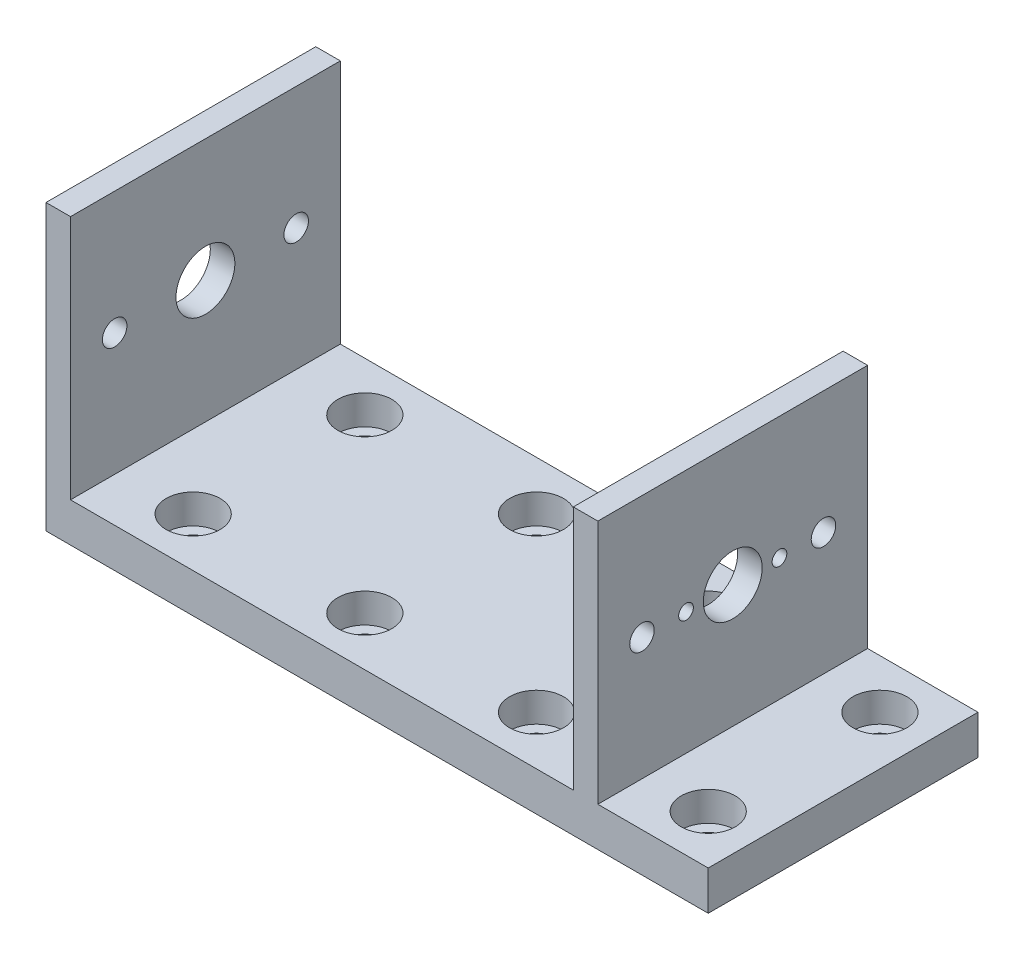
ISO-10303-21;
HEADER;
FILE_DESCRIPTION(('STEP AP214'),'2;1');
FILE_NAME('part.step','',(''),(''),'','','');
FILE_SCHEMA(('AUTOMOTIVE_DESIGN { 1 0 10303 214 1 1 1 1 }'));
ENDSEC;
DATA;
#1=APPLICATION_CONTEXT('core data for automotive mechanical design processes');
#2=APPLICATION_PROTOCOL_DEFINITION('international standard','automotive_design',2000,#1);
#3=PRODUCT_CONTEXT('',#1,'mechanical');
#4=PRODUCT('Part','Part','',(#3));
#5=PRODUCT_RELATED_PRODUCT_CATEGORY('part','',(#4));
#6=PRODUCT_DEFINITION_FORMATION('','',#4);
#7=PRODUCT_DEFINITION_CONTEXT('part definition',#1,'design');
#8=PRODUCT_DEFINITION('design','',#6,#7);
#9=PRODUCT_DEFINITION_SHAPE('','',#8);
#10=(LENGTH_UNIT() NAMED_UNIT(*) SI_UNIT(.MILLI.,.METRE.));
#11=(NAMED_UNIT(*) PLANE_ANGLE_UNIT() SI_UNIT($,.RADIAN.));
#12=(NAMED_UNIT(*) SI_UNIT($,.STERADIAN.) SOLID_ANGLE_UNIT());
#13=UNCERTAINTY_MEASURE_WITH_UNIT(LENGTH_MEASURE(1.E-05),#10,'distance_accuracy_value','');
#14=(GEOMETRIC_REPRESENTATION_CONTEXT(3) GLOBAL_UNCERTAINTY_ASSIGNED_CONTEXT((#13)) GLOBAL_UNIT_ASSIGNED_CONTEXT((#10,
#11,#12)) REPRESENTATION_CONTEXT('',''));
#15=CARTESIAN_POINT('',(0.,0.,0.));
#16=DIRECTION('',(0.,0.,1.));
#17=DIRECTION('',(1.,0.,0.));
#18=AXIS2_PLACEMENT_3D('',#15,#16,#17);
#19=CARTESIAN_POINT('',(0.,8.,0.));
#20=DIRECTION('',(0.,1.,0.));
#21=DIRECTION('',(0.,0.,1.));
#22=AXIS2_PLACEMENT_3D('',#19,#20,#21);
#23=PLANE('',#22);
#24=CARTESIAN_POINT('',(52.5,8.,-17.5));
#25=DIRECTION('',(0.,1.,0.));
#26=DIRECTION('',(0.,0.,1.));
#27=AXIS2_PLACEMENT_3D('',#24,#25,#26);
#28=CIRCLE('',#27,5.5);
#29=CARTESIAN_POINT('',(52.5,8.,-12.));
#30=VERTEX_POINT('',#29);
#31=EDGE_CURVE('E220',#30,#30,#28,.T.);
#32=ORIENTED_EDGE('',*,*,#31,.F.);
#33=EDGE_LOOP('',(#32));
#34=FACE_BOUND('',#33,.T.);
#35=CARTESIAN_POINT('',(52.5,8.,17.5));
#36=DIRECTION('',(0.,1.,0.));
#37=DIRECTION('',(0.,0.,1.));
#38=AXIS2_PLACEMENT_3D('',#35,#36,#37);
#39=CIRCLE('',#38,5.5);
#40=CARTESIAN_POINT('',(52.5,8.,23.));
#41=VERTEX_POINT('',#40);
#42=EDGE_CURVE('E226',#41,#41,#39,.T.);
#43=ORIENTED_EDGE('',*,*,#42,.F.);
#44=EDGE_LOOP('',(#43));
#45=FACE_BOUND('',#44,.T.);
#46=DIRECTION('',(-1.,0.,0.));
#47=VECTOR('',#46,1.);
#48=CARTESIAN_POINT('',(62.5,8.,-27.5));
#49=LINE('',#48,#47);
#50=CARTESIAN_POINT('',(62.5,8.,-27.5));
#51=VERTEX_POINT('',#50);
#52=CARTESIAN_POINT('',(40.,8.,-27.5));
#53=VERTEX_POINT('',#52);
#54=EDGE_CURVE('E132',#51,#53,#49,.T.);
#55=ORIENTED_EDGE('',*,*,#54,.T.);
#56=DIRECTION('',(0.,0.,-1.));
#57=VECTOR('',#56,1.);
#58=CARTESIAN_POINT('',(40.,8.,-27.5));
#59=LINE('',#58,#57);
#60=CARTESIAN_POINT('',(40.,8.,27.5));
#61=VERTEX_POINT('',#60);
#62=EDGE_CURVE('E60',#61,#53,#59,.T.);
#63=ORIENTED_EDGE('',*,*,#62,.F.);
#64=DIRECTION('',(1.,0.,0.));
#65=VECTOR('',#64,1.);
#66=CARTESIAN_POINT('',(62.5,8.,27.5));
#67=LINE('',#66,#65);
#68=CARTESIAN_POINT('',(62.5,8.,27.5));
#69=VERTEX_POINT('',#68);
#70=EDGE_CURVE('E264',#61,#69,#67,.T.);
#71=ORIENTED_EDGE('',*,*,#70,.T.);
#72=DIRECTION('',(0.,0.,-1.));
#73=VECTOR('',#72,1.);
#74=CARTESIAN_POINT('',(62.5,8.,-27.5));
#75=LINE('',#74,#73);
#76=EDGE_CURVE('E133',#69,#51,#75,.T.);
#77=ORIENTED_EDGE('',*,*,#76,.T.);
#78=EDGE_LOOP('',(#55,#63,#71,#77));
#79=FACE_BOUND('',#78,.T.);
#80=ADVANCED_FACE('F43',(#34,#45,#79),#23,.T.);
#81=CARTESIAN_POINT('',(-52.5,8.,-17.5));
#82=DIRECTION('',(0.,1.,0.));
#83=DIRECTION('',(0.,0.,1.));
#84=AXIS2_PLACEMENT_3D('',#81,#82,#83);
#85=CIRCLE('',#84,5.5);
#86=CARTESIAN_POINT('',(-52.5,8.,-12.));
#87=VERTEX_POINT('',#86);
#88=EDGE_CURVE('E210',#87,#87,#85,.T.);
#89=ORIENTED_EDGE('',*,*,#88,.F.);
#90=EDGE_LOOP('',(#89));
#91=FACE_BOUND('',#90,.T.);
#92=CARTESIAN_POINT('',(-52.5,8.,17.5));
#93=DIRECTION('',(0.,1.,0.));
#94=DIRECTION('',(0.,0.,1.));
#95=AXIS2_PLACEMENT_3D('',#92,#93,#94);
#96=CIRCLE('',#95,5.5);
#97=CARTESIAN_POINT('',(-52.5,8.,23.));
#98=VERTEX_POINT('',#97);
#99=EDGE_CURVE('E202',#98,#98,#96,.T.);
#100=ORIENTED_EDGE('',*,*,#99,.F.);
#101=EDGE_LOOP('',(#100));
#102=FACE_BOUND('',#101,.T.);
#103=CARTESIAN_POINT('',(-17.5,8.,17.5));
#104=DIRECTION('',(0.,1.,0.));
#105=DIRECTION('',(0.,0.,1.));
#106=AXIS2_PLACEMENT_3D('',#103,#104,#105);
#107=CIRCLE('',#106,5.5);
#108=CARTESIAN_POINT('',(-17.5,8.,23.));
#109=VERTEX_POINT('',#108);
#110=EDGE_CURVE('E196',#109,#109,#107,.T.);
#111=ORIENTED_EDGE('',*,*,#110,.F.);
#112=EDGE_LOOP('',(#111));
#113=FACE_BOUND('',#112,.T.);
#114=CARTESIAN_POINT('',(17.5,8.,17.5));
#115=DIRECTION('',(0.,1.,0.));
#116=DIRECTION('',(0.,0.,1.));
#117=AXIS2_PLACEMENT_3D('',#114,#115,#116);
#118=CIRCLE('',#117,5.5);
#119=CARTESIAN_POINT('',(17.5,8.,23.));
#120=VERTEX_POINT('',#119);
#121=EDGE_CURVE('E189',#120,#120,#118,.T.);
#122=ORIENTED_EDGE('',*,*,#121,.F.);
#123=EDGE_LOOP('',(#122));
#124=FACE_BOUND('',#123,.T.);
#125=CARTESIAN_POINT('',(17.5,8.,-17.5));
#126=DIRECTION('',(0.,1.,0.));
#127=DIRECTION('',(0.,0.,1.));
#128=AXIS2_PLACEMENT_3D('',#125,#126,#127);
#129=CIRCLE('',#128,5.5);
#130=CARTESIAN_POINT('',(17.5,8.,-12.));
#131=VERTEX_POINT('',#130);
#132=EDGE_CURVE('E214',#131,#131,#129,.T.);
#133=ORIENTED_EDGE('',*,*,#132,.F.);
#134=EDGE_LOOP('',(#133));
#135=FACE_BOUND('',#134,.T.);
#136=CARTESIAN_POINT('',(-17.5,8.,-17.5));
#137=DIRECTION('',(0.,1.,0.));
#138=DIRECTION('',(0.,0.,1.));
#139=AXIS2_PLACEMENT_3D('',#136,#137,#138);
#140=CIRCLE('',#139,5.5);
#141=CARTESIAN_POINT('',(-17.5,8.,-12.));
#142=VERTEX_POINT('',#141);
#143=EDGE_CURVE('E207',#142,#142,#140,.T.);
#144=ORIENTED_EDGE('',*,*,#143,.F.);
#145=EDGE_LOOP('',(#144));
#146=FACE_BOUND('',#145,.T.);
#147=CARTESIAN_POINT('',(-67.5,8.,27.5));
#148=VERTEX_POINT('',#147);
#149=CARTESIAN_POINT('',(35.,8.,27.5));
#150=VERTEX_POINT('',#149);
#151=EDGE_CURVE('E68',#148,#150,#67,.T.);
#152=ORIENTED_EDGE('',*,*,#151,.T.);
#153=DIRECTION('',(0.,0.,1.));
#154=VECTOR('',#153,1.);
#155=CARTESIAN_POINT('',(35.,8.,-27.5));
#156=LINE('',#155,#154);
#157=CARTESIAN_POINT('',(35.,8.,-27.5));
#158=VERTEX_POINT('',#157);
#159=EDGE_CURVE('E135',#158,#150,#156,.T.);
#160=ORIENTED_EDGE('',*,*,#159,.F.);
#161=CARTESIAN_POINT('',(-67.5,8.,-27.5));
#162=VERTEX_POINT('',#161);
#163=EDGE_CURVE('E123',#158,#162,#49,.T.);
#164=ORIENTED_EDGE('',*,*,#163,.T.);
#165=DIRECTION('',(0.,0.,-1.));
#166=VECTOR('',#165,1.);
#167=CARTESIAN_POINT('',(-67.5,8.,27.5));
#168=LINE('',#167,#166);
#169=EDGE_CURVE('E158',#148,#162,#168,.T.);
#170=ORIENTED_EDGE('',*,*,#169,.F.);
#171=EDGE_LOOP('',(#152,#160,#164,#170));
#172=FACE_BOUND('',#171,.T.);
#173=ADVANCED_FACE('F136',(#91,#102,#113,#124,#135,#146,#172),#23,.T.);
#174=CARTESIAN_POINT('',(-52.5,8.,-17.5));
#175=DIRECTION('',(0.,-1.,0.));
#176=DIRECTION('',(0.,0.,-1.));
#177=AXIS2_PLACEMENT_3D('',#174,#175,#176);
#178=CYLINDRICAL_SURFACE('',#177,3.25);
#179=CARTESIAN_POINT('',(-52.5,0.,-17.5));
#180=DIRECTION('',(0.,1.,0.));
#181=DIRECTION('',(0.,0.,1.));
#182=AXIS2_PLACEMENT_3D('',#179,#180,#181);
#183=CIRCLE('',#182,3.25);
#184=CARTESIAN_POINT('',(-52.5,0.,-14.25));
#185=VERTEX_POINT('',#184);
#186=EDGE_CURVE('E259',#185,#185,#183,.T.);
#187=ORIENTED_EDGE('',*,*,#186,.F.);
#188=EDGE_LOOP('',(#187));
#189=FACE_BOUND('',#188,.T.);
#190=CARTESIAN_POINT('',(-52.5,2.,-17.5));
#191=DIRECTION('',(0.,1.,0.));
#192=DIRECTION('',(0.,0.,1.));
#193=AXIS2_PLACEMENT_3D('',#190,#191,#192);
#194=CIRCLE('',#193,3.25);
#195=CARTESIAN_POINT('',(-52.5,2.,-14.25));
#196=VERTEX_POINT('',#195);
#197=EDGE_CURVE('E241',#196,#196,#194,.T.);
#198=ORIENTED_EDGE('',*,*,#197,.T.);
#199=EDGE_LOOP('',(#198));
#200=FACE_BOUND('',#199,.T.);
#201=ADVANCED_FACE('F375',(#189,#200),#178,.F.);
#202=CARTESIAN_POINT('',(-52.5,8.,17.5));
#203=DIRECTION('',(0.,-1.,0.));
#204=DIRECTION('',(0.,0.,-1.));
#205=AXIS2_PLACEMENT_3D('',#202,#203,#204);
#206=CYLINDRICAL_SURFACE('',#205,3.25);
#207=CARTESIAN_POINT('',(-52.5,0.,17.5));
#208=DIRECTION('',(0.,1.,0.));
#209=DIRECTION('',(0.,0.,-1.));
#210=AXIS2_PLACEMENT_3D('',#207,#208,#209);
#211=CIRCLE('',#210,3.25);
#212=CARTESIAN_POINT('',(-52.5,0.,14.25));
#213=VERTEX_POINT('',#212);
#214=EDGE_CURVE('E256',#213,#213,#211,.T.);
#215=ORIENTED_EDGE('',*,*,#214,.F.);
#216=EDGE_LOOP('',(#215));
#217=FACE_BOUND('',#216,.T.);
#218=CARTESIAN_POINT('',(-52.5,2.,17.5));
#219=DIRECTION('',(0.,1.,0.));
#220=DIRECTION('',(0.,0.,1.));
#221=AXIS2_PLACEMENT_3D('',#218,#219,#220);
#222=CIRCLE('',#221,3.25);
#223=CARTESIAN_POINT('',(-52.5,2.,20.75));
#224=VERTEX_POINT('',#223);
#225=EDGE_CURVE('E291',#224,#224,#222,.T.);
#226=ORIENTED_EDGE('',*,*,#225,.T.);
#227=EDGE_LOOP('',(#226));
#228=FACE_BOUND('',#227,.T.);
#229=ADVANCED_FACE('F525',(#217,#228),#206,.F.);
#230=CARTESIAN_POINT('',(-17.5,8.,17.5));
#231=DIRECTION('',(0.,-1.,0.));
#232=DIRECTION('',(0.,0.,-1.));
#233=AXIS2_PLACEMENT_3D('',#230,#231,#232);
#234=CYLINDRICAL_SURFACE('',#233,3.25);
#235=CARTESIAN_POINT('',(-17.5,0.,17.5));
#236=DIRECTION('',(0.,1.,0.));
#237=DIRECTION('',(0.,0.,1.));
#238=AXIS2_PLACEMENT_3D('',#235,#236,#237);
#239=CIRCLE('',#238,3.25);
#240=CARTESIAN_POINT('',(-17.5,0.,20.75));
#241=VERTEX_POINT('',#240);
#242=EDGE_CURVE('E253',#241,#241,#239,.T.);
#243=ORIENTED_EDGE('',*,*,#242,.F.);
#244=EDGE_LOOP('',(#243));
#245=FACE_BOUND('',#244,.T.);
#246=CARTESIAN_POINT('',(-17.5,2.,17.5));
#247=DIRECTION('',(0.,1.,0.));
#248=DIRECTION('',(0.,0.,1.));
#249=AXIS2_PLACEMENT_3D('',#246,#247,#248);
#250=CIRCLE('',#249,3.25);
#251=CARTESIAN_POINT('',(-17.5,2.,20.75));
#252=VERTEX_POINT('',#251);
#253=EDGE_CURVE('E288',#252,#252,#250,.T.);
#254=ORIENTED_EDGE('',*,*,#253,.T.);
#255=EDGE_LOOP('',(#254));
#256=FACE_BOUND('',#255,.T.);
#257=ADVANCED_FACE('F522',(#245,#256),#234,.F.);
#258=CARTESIAN_POINT('',(-17.5,8.,-17.5));
#259=DIRECTION('',(0.,-1.,0.));
#260=DIRECTION('',(0.,0.,-1.));
#261=AXIS2_PLACEMENT_3D('',#258,#259,#260);
#262=CYLINDRICAL_SURFACE('',#261,3.25);
#263=CARTESIAN_POINT('',(-17.5,0.,-17.5));
#264=DIRECTION('',(0.,1.,0.));
#265=DIRECTION('',(0.,0.,-1.));
#266=AXIS2_PLACEMENT_3D('',#263,#264,#265);
#267=CIRCLE('',#266,3.25);
#268=CARTESIAN_POINT('',(-17.5,0.,-20.75));
#269=VERTEX_POINT('',#268);
#270=EDGE_CURVE('E250',#269,#269,#267,.T.);
#271=ORIENTED_EDGE('',*,*,#270,.F.);
#272=EDGE_LOOP('',(#271));
#273=FACE_BOUND('',#272,.T.);
#274=CARTESIAN_POINT('',(-17.5,2.,-17.5));
#275=DIRECTION('',(0.,1.,0.));
#276=DIRECTION('',(0.,0.,1.));
#277=AXIS2_PLACEMENT_3D('',#274,#275,#276);
#278=CIRCLE('',#277,3.25);
#279=CARTESIAN_POINT('',(-17.5,2.,-14.25));
#280=VERTEX_POINT('',#279);
#281=EDGE_CURVE('E285',#280,#280,#278,.T.);
#282=ORIENTED_EDGE('',*,*,#281,.T.);
#283=EDGE_LOOP('',(#282));
#284=FACE_BOUND('',#283,.T.);
#285=ADVANCED_FACE('F518',(#273,#284),#262,.F.);
#286=CARTESIAN_POINT('',(52.5,8.,17.5));
#287=DIRECTION('',(0.,-1.,0.));
#288=DIRECTION('',(0.,0.,-1.));
#289=AXIS2_PLACEMENT_3D('',#286,#287,#288);
#290=CYLINDRICAL_SURFACE('',#289,3.25);
#291=CARTESIAN_POINT('',(52.5,0.,17.5));
#292=DIRECTION('',(0.,1.,0.));
#293=DIRECTION('',(0.,0.,1.));
#294=AXIS2_PLACEMENT_3D('',#291,#292,#293);
#295=CIRCLE('',#294,3.25);
#296=CARTESIAN_POINT('',(52.5,0.,20.75));
#297=VERTEX_POINT('',#296);
#298=EDGE_CURVE('E247',#297,#297,#295,.T.);
#299=ORIENTED_EDGE('',*,*,#298,.F.);
#300=EDGE_LOOP('',(#299));
#301=FACE_BOUND('',#300,.T.);
#302=CARTESIAN_POINT('',(52.5,2.,17.5));
#303=DIRECTION('',(0.,1.,0.));
#304=DIRECTION('',(0.,0.,1.));
#305=AXIS2_PLACEMENT_3D('',#302,#303,#304);
#306=CIRCLE('',#305,3.25);
#307=CARTESIAN_POINT('',(52.5,2.,20.75));
#308=VERTEX_POINT('',#307);
#309=EDGE_CURVE('E282',#308,#308,#306,.T.);
#310=ORIENTED_EDGE('',*,*,#309,.T.);
#311=EDGE_LOOP('',(#310));
#312=FACE_BOUND('',#311,.T.);
#313=ADVANCED_FACE('F514',(#301,#312),#290,.F.);
#314=CARTESIAN_POINT('',(17.5,8.,17.5));
#315=DIRECTION('',(0.,-1.,0.));
#316=DIRECTION('',(0.,0.,-1.));
#317=AXIS2_PLACEMENT_3D('',#314,#315,#316);
#318=CYLINDRICAL_SURFACE('',#317,3.25);
#319=CARTESIAN_POINT('',(17.5,0.,17.5));
#320=DIRECTION('',(0.,1.,0.));
#321=DIRECTION('',(0.,0.,-1.));
#322=AXIS2_PLACEMENT_3D('',#319,#320,#321);
#323=CIRCLE('',#322,3.25);
#324=CARTESIAN_POINT('',(17.5,0.,14.25));
#325=VERTEX_POINT('',#324);
#326=EDGE_CURVE('E244',#325,#325,#323,.T.);
#327=ORIENTED_EDGE('',*,*,#326,.F.);
#328=EDGE_LOOP('',(#327));
#329=FACE_BOUND('',#328,.T.);
#330=CARTESIAN_POINT('',(17.5,2.,17.5));
#331=DIRECTION('',(0.,1.,0.));
#332=DIRECTION('',(0.,0.,1.));
#333=AXIS2_PLACEMENT_3D('',#330,#331,#332);
#334=CIRCLE('',#333,3.25);
#335=CARTESIAN_POINT('',(17.5,2.,20.75));
#336=VERTEX_POINT('',#335);
#337=EDGE_CURVE('E279',#336,#336,#334,.T.);
#338=ORIENTED_EDGE('',*,*,#337,.T.);
#339=EDGE_LOOP('',(#338));
#340=FACE_BOUND('',#339,.T.);
#341=ADVANCED_FACE('F510',(#329,#340),#318,.F.);
#342=CARTESIAN_POINT('',(17.5,8.,-17.5));
#343=DIRECTION('',(0.,-1.,0.));
#344=DIRECTION('',(0.,0.,-1.));
#345=AXIS2_PLACEMENT_3D('',#342,#343,#344);
#346=CYLINDRICAL_SURFACE('',#345,3.25);
#347=CARTESIAN_POINT('',(17.5,0.,-17.5));
#348=DIRECTION('',(0.,1.,0.));
#349=DIRECTION('',(0.,0.,1.));
#350=AXIS2_PLACEMENT_3D('',#347,#348,#349);
#351=CIRCLE('',#350,3.25);
#352=CARTESIAN_POINT('',(17.5,0.,-14.25));
#353=VERTEX_POINT('',#352);
#354=EDGE_CURVE('E240',#353,#353,#351,.T.);
#355=ORIENTED_EDGE('',*,*,#354,.F.);
#356=EDGE_LOOP('',(#355));
#357=FACE_BOUND('',#356,.T.);
#358=CARTESIAN_POINT('',(17.5,2.,-17.5));
#359=DIRECTION('',(0.,1.,0.));
#360=DIRECTION('',(0.,0.,1.));
#361=AXIS2_PLACEMENT_3D('',#358,#359,#360);
#362=CIRCLE('',#361,3.25);
#363=CARTESIAN_POINT('',(17.5,2.,-14.25));
#364=VERTEX_POINT('',#363);
#365=EDGE_CURVE('E276',#364,#364,#362,.T.);
#366=ORIENTED_EDGE('',*,*,#365,.T.);
#367=EDGE_LOOP('',(#366));
#368=FACE_BOUND('',#367,.T.);
#369=ADVANCED_FACE('F506',(#357,#368),#346,.F.);
#370=CARTESIAN_POINT('',(52.5,8.,-17.5));
#371=DIRECTION('',(0.,-1.,0.));
#372=DIRECTION('',(0.,0.,-1.));
#373=AXIS2_PLACEMENT_3D('',#370,#371,#372);
#374=CYLINDRICAL_SURFACE('',#373,3.25);
#375=CARTESIAN_POINT('',(52.5,0.,-17.5));
#376=DIRECTION('',(0.,1.,0.));
#377=DIRECTION('',(0.,0.,-1.));
#378=AXIS2_PLACEMENT_3D('',#375,#376,#377);
#379=CIRCLE('',#378,3.25);
#380=CARTESIAN_POINT('',(52.5,0.,-20.75));
#381=VERTEX_POINT('',#380);
#382=EDGE_CURVE('E237',#381,#381,#379,.T.);
#383=ORIENTED_EDGE('',*,*,#382,.F.);
#384=EDGE_LOOP('',(#383));
#385=FACE_BOUND('',#384,.T.);
#386=CARTESIAN_POINT('',(52.5,2.,-17.5));
#387=DIRECTION('',(0.,1.,0.));
#388=DIRECTION('',(0.,0.,1.));
#389=AXIS2_PLACEMENT_3D('',#386,#387,#388);
#390=CIRCLE('',#389,3.25);
#391=CARTESIAN_POINT('',(52.5,2.,-14.25));
#392=VERTEX_POINT('',#391);
#393=EDGE_CURVE('E234',#392,#392,#390,.T.);
#394=ORIENTED_EDGE('',*,*,#393,.T.);
#395=EDGE_LOOP('',(#394));
#396=FACE_BOUND('',#395,.T.);
#397=ADVANCED_FACE('F385',(#385,#396),#374,.F.);
#398=CARTESIAN_POINT('',(0.,0.,0.));
#399=DIRECTION('',(0.,1.,0.));
#400=DIRECTION('',(0.,0.,1.));
#401=AXIS2_PLACEMENT_3D('',#398,#399,#400);
#402=PLANE('',#401);
#403=DIRECTION('',(1.,0.,0.));
#404=VECTOR('',#403,1.);
#405=CARTESIAN_POINT('',(62.5,0.,27.5));
#406=LINE('',#405,#404);
#407=CARTESIAN_POINT('',(-72.5,0.,27.5));
#408=VERTEX_POINT('',#407);
#409=CARTESIAN_POINT('',(62.5,0.,27.5));
#410=VERTEX_POINT('',#409);
#411=EDGE_CURVE('E262',#408,#410,#406,.T.);
#412=ORIENTED_EDGE('',*,*,#411,.F.);
#413=DIRECTION('',(0.,0.,1.));
#414=VECTOR('',#413,1.);
#415=CARTESIAN_POINT('',(-72.5,0.,27.5));
#416=LINE('',#415,#414);
#417=CARTESIAN_POINT('',(-72.5,0.,-27.5));
#418=VERTEX_POINT('',#417);
#419=EDGE_CURVE('E180',#418,#408,#416,.T.);
#420=ORIENTED_EDGE('',*,*,#419,.F.);
#421=DIRECTION('',(-1.,0.,0.));
#422=VECTOR('',#421,1.);
#423=CARTESIAN_POINT('',(62.5,0.,-27.5));
#424=LINE('',#423,#422);
#425=CARTESIAN_POINT('',(62.5,0.,-27.5));
#426=VERTEX_POINT('',#425);
#427=EDGE_CURVE('E270',#426,#418,#424,.T.);
#428=ORIENTED_EDGE('',*,*,#427,.F.);
#429=DIRECTION('',(0.,0.,-1.));
#430=VECTOR('',#429,1.);
#431=CARTESIAN_POINT('',(62.5,0.,-27.5));
#432=LINE('',#431,#430);
#433=EDGE_CURVE('E268',#410,#426,#432,.T.);
#434=ORIENTED_EDGE('',*,*,#433,.F.);
#435=EDGE_LOOP('',(#412,#420,#428,#434));
#436=FACE_BOUND('',#435,.T.);
#437=ORIENTED_EDGE('',*,*,#186,.T.);
#438=EDGE_LOOP('',(#437));
#439=FACE_BOUND('',#438,.T.);
#440=ORIENTED_EDGE('',*,*,#214,.T.);
#441=EDGE_LOOP('',(#440));
#442=FACE_BOUND('',#441,.T.);
#443=ORIENTED_EDGE('',*,*,#242,.T.);
#444=EDGE_LOOP('',(#443));
#445=FACE_BOUND('',#444,.T.);
#446=ORIENTED_EDGE('',*,*,#270,.T.);
#447=EDGE_LOOP('',(#446));
#448=FACE_BOUND('',#447,.T.);
#449=ORIENTED_EDGE('',*,*,#298,.T.);
#450=EDGE_LOOP('',(#449));
#451=FACE_BOUND('',#450,.T.);
#452=ORIENTED_EDGE('',*,*,#326,.T.);
#453=EDGE_LOOP('',(#452));
#454=FACE_BOUND('',#453,.T.);
#455=ORIENTED_EDGE('',*,*,#354,.T.);
#456=EDGE_LOOP('',(#455));
#457=FACE_BOUND('',#456,.T.);
#458=ORIENTED_EDGE('',*,*,#382,.T.);
#459=EDGE_LOOP('',(#458));
#460=FACE_BOUND('',#459,.T.);
#461=ADVANCED_FACE('F382',(#436,#439,#442,#445,#448,#451,#454,#457,#460),#402,.F.);
#462=CARTESIAN_POINT('',(62.5,8.,27.5));
#463=DIRECTION('',(0.,0.,-1.));
#464=DIRECTION('',(-1.,0.,0.));
#465=AXIS2_PLACEMENT_3D('',#462,#463,#464);
#466=PLANE('',#465);
#467=ORIENTED_EDGE('',*,*,#411,.T.);
#468=DIRECTION('',(0.,-1.,0.));
#469=VECTOR('',#468,1.);
#470=CARTESIAN_POINT('',(62.5,8.,27.5));
#471=LINE('',#470,#469);
#472=EDGE_CURVE('E11',#69,#410,#471,.T.);
#473=ORIENTED_EDGE('',*,*,#472,.F.);
#474=ORIENTED_EDGE('',*,*,#70,.F.);
#475=DIRECTION('',(0.,-1.,0.));
#476=VECTOR('',#475,1.);
#477=CARTESIAN_POINT('',(40.,58.,27.5));
#478=LINE('',#477,#476);
#479=CARTESIAN_POINT('',(40.,58.,27.5));
#480=VERTEX_POINT('',#479);
#481=EDGE_CURVE('E147',#480,#61,#478,.T.);
#482=ORIENTED_EDGE('',*,*,#481,.F.);
#483=DIRECTION('',(1.,0.,0.));
#484=VECTOR('',#483,1.);
#485=CARTESIAN_POINT('',(35.,58.,27.5));
#486=LINE('',#485,#484);
#487=CARTESIAN_POINT('',(35.,58.,27.5));
#488=VERTEX_POINT('',#487);
#489=EDGE_CURVE('E155',#488,#480,#486,.T.);
#490=ORIENTED_EDGE('',*,*,#489,.F.);
#491=DIRECTION('',(0.,-1.,0.));
#492=VECTOR('',#491,1.);
#493=CARTESIAN_POINT('',(35.,58.,27.5));
#494=LINE('',#493,#492);
#495=EDGE_CURVE('E144',#488,#150,#494,.T.);
#496=ORIENTED_EDGE('',*,*,#495,.T.);
#497=ORIENTED_EDGE('',*,*,#151,.F.);
#498=DIRECTION('',(0.,-1.,0.));
#499=VECTOR('',#498,1.);
#500=CARTESIAN_POINT('',(-67.5,58.,27.5));
#501=LINE('',#500,#499);
#502=CARTESIAN_POINT('',(-67.5,58.,27.5));
#503=VERTEX_POINT('',#502);
#504=EDGE_CURVE('E177',#503,#148,#501,.T.);
#505=ORIENTED_EDGE('',*,*,#504,.F.);
#506=DIRECTION('',(1.,0.,0.));
#507=VECTOR('',#506,1.);
#508=CARTESIAN_POINT('',(-72.5,58.,27.5));
#509=LINE('',#508,#507);
#510=CARTESIAN_POINT('',(-72.5,58.,27.5));
#511=VERTEX_POINT('',#510);
#512=EDGE_CURVE('E171',#511,#503,#509,.T.);
#513=ORIENTED_EDGE('',*,*,#512,.F.);
#514=DIRECTION('',(0.,1.,0.));
#515=VECTOR('',#514,1.);
#516=CARTESIAN_POINT('',(-72.5,8.,27.5));
#517=LINE('',#516,#515);
#518=EDGE_CURVE('E183',#408,#511,#517,.T.);
#519=ORIENTED_EDGE('',*,*,#518,.F.);
#520=EDGE_LOOP('',(#467,#473,#474,#482,#490,#496,#497,#505,#513,#519));
#521=FACE_BOUND('',#520,.T.);
#522=ADVANCED_FACE('F45',(#521),#466,.F.);
#523=CARTESIAN_POINT('',(62.5,8.,-27.5));
#524=DIRECTION('',(-1.,0.,0.));
#525=DIRECTION('',(0.,0.,1.));
#526=AXIS2_PLACEMENT_3D('',#523,#524,#525);
#527=PLANE('',#526);
#528=ORIENTED_EDGE('',*,*,#433,.T.);
#529=DIRECTION('',(0.,-1.,0.));
#530=VECTOR('',#529,1.);
#531=CARTESIAN_POINT('',(62.5,8.,-27.5));
#532=LINE('',#531,#530);
#533=EDGE_CURVE('E52',#51,#426,#532,.T.);
#534=ORIENTED_EDGE('',*,*,#533,.F.);
#535=ORIENTED_EDGE('',*,*,#76,.F.);
#536=ORIENTED_EDGE('',*,*,#472,.T.);
#537=EDGE_LOOP('',(#528,#534,#535,#536));
#538=FACE_BOUND('',#537,.T.);
#539=ADVANCED_FACE('F389',(#538),#527,.F.);
#540=CARTESIAN_POINT('',(62.5,8.,-27.5));
#541=DIRECTION('',(0.,0.,1.));
#542=DIRECTION('',(1.,0.,0.));
#543=AXIS2_PLACEMENT_3D('',#540,#541,#542);
#544=PLANE('',#543);
#545=ORIENTED_EDGE('',*,*,#427,.T.);
#546=DIRECTION('',(0.,-1.,0.));
#547=VECTOR('',#546,1.);
#548=CARTESIAN_POINT('',(-72.5,0.,-27.5));
#549=LINE('',#548,#547);
#550=CARTESIAN_POINT('',(-72.5,58.,-27.5));
#551=VERTEX_POINT('',#550);
#552=EDGE_CURVE('E185',#551,#418,#549,.T.);
#553=ORIENTED_EDGE('',*,*,#552,.F.);
#554=DIRECTION('',(-1.,0.,0.));
#555=VECTOR('',#554,1.);
#556=CARTESIAN_POINT('',(-67.5,58.,-27.5));
#557=LINE('',#556,#555);
#558=CARTESIAN_POINT('',(-67.5,58.,-27.5));
#559=VERTEX_POINT('',#558);
#560=EDGE_CURVE('E165',#559,#551,#557,.T.);
#561=ORIENTED_EDGE('',*,*,#560,.F.);
#562=DIRECTION('',(0.,-1.,0.));
#563=VECTOR('',#562,1.);
#564=CARTESIAN_POINT('',(-67.5,58.,-27.5));
#565=LINE('',#564,#563);
#566=EDGE_CURVE('E130',#559,#162,#565,.T.);
#567=ORIENTED_EDGE('',*,*,#566,.T.);
#568=ORIENTED_EDGE('',*,*,#163,.F.);
#569=DIRECTION('',(0.,-1.,0.));
#570=VECTOR('',#569,1.);
#571=CARTESIAN_POINT('',(35.,58.,-27.5));
#572=LINE('',#571,#570);
#573=CARTESIAN_POINT('',(35.,58.,-27.5));
#574=VERTEX_POINT('',#573);
#575=EDGE_CURVE('E126',#574,#158,#572,.T.);
#576=ORIENTED_EDGE('',*,*,#575,.F.);
#577=DIRECTION('',(-1.,0.,0.));
#578=VECTOR('',#577,1.);
#579=CARTESIAN_POINT('',(40.,58.,-27.5));
#580=LINE('',#579,#578);
#581=CARTESIAN_POINT('',(40.,58.,-27.5));
#582=VERTEX_POINT('',#581);
#583=EDGE_CURVE('E161',#582,#574,#580,.T.);
#584=ORIENTED_EDGE('',*,*,#583,.F.);
#585=DIRECTION('',(0.,-1.,0.));
#586=VECTOR('',#585,1.);
#587=CARTESIAN_POINT('',(40.,58.,-27.5));
#588=LINE('',#587,#586);
#589=EDGE_CURVE('E145',#582,#53,#588,.T.);
#590=ORIENTED_EDGE('',*,*,#589,.T.);
#591=ORIENTED_EDGE('',*,*,#54,.F.);
#592=ORIENTED_EDGE('',*,*,#533,.T.);
#593=EDGE_LOOP('',(#545,#553,#561,#567,#568,#576,#584,#590,#591,#592));
#594=FACE_BOUND('',#593,.T.);
#595=ADVANCED_FACE('F124',(#594),#544,.F.);
#596=CARTESIAN_POINT('',(52.5,2.,-17.5));
#597=DIRECTION('',(0.,1.,0.));
#598=DIRECTION('',(0.,0.,1.));
#599=AXIS2_PLACEMENT_3D('',#596,#597,#598);
#600=CYLINDRICAL_SURFACE('',#599,5.5);
#601=CARTESIAN_POINT('',(52.5,2.,-17.5));
#602=DIRECTION('',(0.,1.,0.));
#603=DIRECTION('',(0.,0.,1.));
#604=AXIS2_PLACEMENT_3D('',#601,#602,#603);
#605=CIRCLE('',#604,5.5);
#606=CARTESIAN_POINT('',(52.5,2.,-12.));
#607=VERTEX_POINT('',#606);
#608=EDGE_CURVE('E223',#607,#607,#605,.T.);
#609=ORIENTED_EDGE('',*,*,#608,.F.);
#610=EDGE_LOOP('',(#609));
#611=FACE_BOUND('',#610,.T.);
#612=ORIENTED_EDGE('',*,*,#31,.T.);
#613=EDGE_LOOP('',(#612));
#614=FACE_BOUND('',#613,.T.);
#615=ADVANCED_FACE('F388',(#611,#614),#600,.F.);
#616=CARTESIAN_POINT('',(52.5,2.,-17.5));
#617=DIRECTION('',(0.,1.,0.));
#618=DIRECTION('',(0.,0.,1.));
#619=AXIS2_PLACEMENT_3D('',#616,#617,#618);
#620=PLANE('',#619);
#621=ORIENTED_EDGE('',*,*,#393,.F.);
#622=EDGE_LOOP('',(#621));
#623=FACE_BOUND('',#622,.T.);
#624=ORIENTED_EDGE('',*,*,#608,.T.);
#625=EDGE_LOOP('',(#624));
#626=FACE_BOUND('',#625,.T.);
#627=ADVANCED_FACE('F481',(#623,#626),#620,.T.);
#628=CARTESIAN_POINT('',(17.5,2.,-17.5));
#629=DIRECTION('',(0.,1.,0.));
#630=DIRECTION('',(0.,0.,1.));
#631=AXIS2_PLACEMENT_3D('',#628,#629,#630);
#632=CYLINDRICAL_SURFACE('',#631,5.5);
#633=CARTESIAN_POINT('',(17.5,2.,-17.5));
#634=DIRECTION('',(0.,1.,0.));
#635=DIRECTION('',(0.,0.,1.));
#636=AXIS2_PLACEMENT_3D('',#633,#634,#635);
#637=CIRCLE('',#636,5.5);
#638=CARTESIAN_POINT('',(17.5,2.,-12.));
#639=VERTEX_POINT('',#638);
#640=EDGE_CURVE('E217',#639,#639,#637,.T.);
#641=ORIENTED_EDGE('',*,*,#640,.F.);
#642=EDGE_LOOP('',(#641));
#643=FACE_BOUND('',#642,.T.);
#644=ORIENTED_EDGE('',*,*,#132,.T.);
#645=EDGE_LOOP('',(#644));
#646=FACE_BOUND('',#645,.T.);
#647=ADVANCED_FACE('F478',(#643,#646),#632,.F.);
#648=CARTESIAN_POINT('',(17.5,2.,-17.5));
#649=DIRECTION('',(0.,1.,0.));
#650=DIRECTION('',(0.,0.,1.));
#651=AXIS2_PLACEMENT_3D('',#648,#649,#650);
#652=PLANE('',#651);
#653=ORIENTED_EDGE('',*,*,#365,.F.);
#654=EDGE_LOOP('',(#653));
#655=FACE_BOUND('',#654,.T.);
#656=ORIENTED_EDGE('',*,*,#640,.T.);
#657=EDGE_LOOP('',(#656));
#658=FACE_BOUND('',#657,.T.);
#659=ADVANCED_FACE('F446',(#655,#658),#652,.T.);
#660=CARTESIAN_POINT('',(17.5,2.,17.5));
#661=DIRECTION('',(0.,1.,0.));
#662=DIRECTION('',(0.,0.,1.));
#663=AXIS2_PLACEMENT_3D('',#660,#661,#662);
#664=CYLINDRICAL_SURFACE('',#663,5.5);
#665=CARTESIAN_POINT('',(17.5,2.,17.5));
#666=DIRECTION('',(0.,1.,0.));
#667=DIRECTION('',(0.,0.,1.));
#668=AXIS2_PLACEMENT_3D('',#665,#666,#667);
#669=CIRCLE('',#668,5.5);
#670=CARTESIAN_POINT('',(17.5,2.,23.));
#671=VERTEX_POINT('',#670);
#672=EDGE_CURVE('E193',#671,#671,#669,.T.);
#673=ORIENTED_EDGE('',*,*,#672,.F.);
#674=EDGE_LOOP('',(#673));
#675=FACE_BOUND('',#674,.T.);
#676=ORIENTED_EDGE('',*,*,#121,.T.);
#677=EDGE_LOOP('',(#676));
#678=FACE_BOUND('',#677,.T.);
#679=ADVANCED_FACE('F442',(#675,#678),#664,.F.);
#680=CARTESIAN_POINT('',(17.5,2.,17.5));
#681=DIRECTION('',(0.,1.,0.));
#682=DIRECTION('',(0.,0.,1.));
#683=AXIS2_PLACEMENT_3D('',#680,#681,#682);
#684=PLANE('',#683);
#685=ORIENTED_EDGE('',*,*,#337,.F.);
#686=EDGE_LOOP('',(#685));
#687=FACE_BOUND('',#686,.T.);
#688=ORIENTED_EDGE('',*,*,#672,.T.);
#689=EDGE_LOOP('',(#688));
#690=FACE_BOUND('',#689,.T.);
#691=ADVANCED_FACE('F445',(#687,#690),#684,.T.);
#692=CARTESIAN_POINT('',(52.5,2.,17.5));
#693=DIRECTION('',(0.,1.,0.));
#694=DIRECTION('',(0.,0.,1.));
#695=AXIS2_PLACEMENT_3D('',#692,#693,#694);
#696=CYLINDRICAL_SURFACE('',#695,5.5);
#697=CARTESIAN_POINT('',(52.5,2.,17.5));
#698=DIRECTION('',(0.,1.,0.));
#699=DIRECTION('',(0.,0.,1.));
#700=AXIS2_PLACEMENT_3D('',#697,#698,#699);
#701=CIRCLE('',#700,5.5);
#702=CARTESIAN_POINT('',(52.5,2.,23.));
#703=VERTEX_POINT('',#702);
#704=EDGE_CURVE('E192',#703,#703,#701,.T.);
#705=ORIENTED_EDGE('',*,*,#704,.F.);
#706=EDGE_LOOP('',(#705));
#707=FACE_BOUND('',#706,.T.);
#708=ORIENTED_EDGE('',*,*,#42,.T.);
#709=EDGE_LOOP('',(#708));
#710=FACE_BOUND('',#709,.T.);
#711=ADVANCED_FACE('F450',(#707,#710),#696,.F.);
#712=CARTESIAN_POINT('',(52.5,2.,17.5));
#713=DIRECTION('',(0.,1.,0.));
#714=DIRECTION('',(0.,0.,1.));
#715=AXIS2_PLACEMENT_3D('',#712,#713,#714);
#716=PLANE('',#715);
#717=ORIENTED_EDGE('',*,*,#309,.F.);
#718=EDGE_LOOP('',(#717));
#719=FACE_BOUND('',#718,.T.);
#720=ORIENTED_EDGE('',*,*,#704,.T.);
#721=EDGE_LOOP('',(#720));
#722=FACE_BOUND('',#721,.T.);
#723=ADVANCED_FACE('F473',(#719,#722),#716,.T.);
#724=CARTESIAN_POINT('',(-17.5,2.,-17.5));
#725=DIRECTION('',(0.,1.,0.));
#726=DIRECTION('',(0.,0.,1.));
#727=AXIS2_PLACEMENT_3D('',#724,#725,#726);
#728=CYLINDRICAL_SURFACE('',#727,5.5);
#729=CARTESIAN_POINT('',(-17.5,2.,-17.5));
#730=DIRECTION('',(0.,1.,0.));
#731=DIRECTION('',(0.,0.,1.));
#732=AXIS2_PLACEMENT_3D('',#729,#730,#731);
#733=CIRCLE('',#732,5.5);
#734=CARTESIAN_POINT('',(-17.5,2.,-12.));
#735=VERTEX_POINT('',#734);
#736=EDGE_CURVE('E211',#735,#735,#733,.T.);
#737=ORIENTED_EDGE('',*,*,#736,.F.);
#738=EDGE_LOOP('',(#737));
#739=FACE_BOUND('',#738,.T.);
#740=ORIENTED_EDGE('',*,*,#143,.T.);
#741=EDGE_LOOP('',(#740));
#742=FACE_BOUND('',#741,.T.);
#743=ADVANCED_FACE('F470',(#739,#742),#728,.F.);
#744=CARTESIAN_POINT('',(-17.5,2.,-17.5));
#745=DIRECTION('',(0.,1.,0.));
#746=DIRECTION('',(0.,0.,1.));
#747=AXIS2_PLACEMENT_3D('',#744,#745,#746);
#748=PLANE('',#747);
#749=ORIENTED_EDGE('',*,*,#281,.F.);
#750=EDGE_LOOP('',(#749));
#751=FACE_BOUND('',#750,.T.);
#752=ORIENTED_EDGE('',*,*,#736,.T.);
#753=EDGE_LOOP('',(#752));
#754=FACE_BOUND('',#753,.T.);
#755=ADVANCED_FACE('F456',(#751,#754),#748,.T.);
#756=CARTESIAN_POINT('',(-17.5,2.,17.5));
#757=DIRECTION('',(0.,1.,0.));
#758=DIRECTION('',(0.,0.,1.));
#759=AXIS2_PLACEMENT_3D('',#756,#757,#758);
#760=CYLINDRICAL_SURFACE('',#759,5.5);
#761=CARTESIAN_POINT('',(-17.5,2.,17.5));
#762=DIRECTION('',(0.,1.,0.));
#763=DIRECTION('',(0.,0.,1.));
#764=AXIS2_PLACEMENT_3D('',#761,#762,#763);
#765=CIRCLE('',#764,5.5);
#766=CARTESIAN_POINT('',(-17.5,2.,23.));
#767=VERTEX_POINT('',#766);
#768=EDGE_CURVE('E199',#767,#767,#765,.T.);
#769=ORIENTED_EDGE('',*,*,#768,.F.);
#770=EDGE_LOOP('',(#769));
#771=FACE_BOUND('',#770,.T.);
#772=ORIENTED_EDGE('',*,*,#110,.T.);
#773=EDGE_LOOP('',(#772));
#774=FACE_BOUND('',#773,.T.);
#775=ADVANCED_FACE('F452',(#771,#774),#760,.F.);
#776=CARTESIAN_POINT('',(-17.5,2.,17.5));
#777=DIRECTION('',(0.,1.,0.));
#778=DIRECTION('',(0.,0.,1.));
#779=AXIS2_PLACEMENT_3D('',#776,#777,#778);
#780=PLANE('',#779);
#781=ORIENTED_EDGE('',*,*,#253,.F.);
#782=EDGE_LOOP('',(#781));
#783=FACE_BOUND('',#782,.T.);
#784=ORIENTED_EDGE('',*,*,#768,.T.);
#785=EDGE_LOOP('',(#784));
#786=FACE_BOUND('',#785,.T.);
#787=ADVANCED_FACE('F455',(#783,#786),#780,.T.);
#788=CARTESIAN_POINT('',(-52.5,2.,17.5));
#789=DIRECTION('',(0.,1.,0.));
#790=DIRECTION('',(0.,0.,1.));
#791=AXIS2_PLACEMENT_3D('',#788,#789,#790);
#792=CYLINDRICAL_SURFACE('',#791,5.5);
#793=CARTESIAN_POINT('',(-52.5,2.,17.5));
#794=DIRECTION('',(0.,1.,0.));
#795=DIRECTION('',(0.,0.,1.));
#796=AXIS2_PLACEMENT_3D('',#793,#794,#795);
#797=CIRCLE('',#796,5.5);
#798=CARTESIAN_POINT('',(-52.5,2.,23.));
#799=VERTEX_POINT('',#798);
#800=EDGE_CURVE('E188',#799,#799,#797,.T.);
#801=ORIENTED_EDGE('',*,*,#800,.F.);
#802=EDGE_LOOP('',(#801));
#803=FACE_BOUND('',#802,.T.);
#804=ORIENTED_EDGE('',*,*,#99,.T.);
#805=EDGE_LOOP('',(#804));
#806=FACE_BOUND('',#805,.T.);
#807=ADVANCED_FACE('F460',(#803,#806),#792,.F.);
#808=CARTESIAN_POINT('',(-52.5,2.,17.5));
#809=DIRECTION('',(0.,1.,0.));
#810=DIRECTION('',(0.,0.,1.));
#811=AXIS2_PLACEMENT_3D('',#808,#809,#810);
#812=PLANE('',#811);
#813=ORIENTED_EDGE('',*,*,#225,.F.);
#814=EDGE_LOOP('',(#813));
#815=FACE_BOUND('',#814,.T.);
#816=ORIENTED_EDGE('',*,*,#800,.T.);
#817=EDGE_LOOP('',(#816));
#818=FACE_BOUND('',#817,.T.);
#819=ADVANCED_FACE('F464',(#815,#818),#812,.T.);
#820=CARTESIAN_POINT('',(-52.5,2.,-17.5));
#821=DIRECTION('',(0.,1.,0.));
#822=DIRECTION('',(0.,0.,1.));
#823=AXIS2_PLACEMENT_3D('',#820,#821,#822);
#824=CYLINDRICAL_SURFACE('',#823,5.5);
#825=CARTESIAN_POINT('',(-52.5,2.,-17.5));
#826=DIRECTION('',(0.,1.,0.));
#827=DIRECTION('',(0.,0.,1.));
#828=AXIS2_PLACEMENT_3D('',#825,#826,#827);
#829=CIRCLE('',#828,5.5);
#830=CARTESIAN_POINT('',(-52.5,2.,-12.));
#831=VERTEX_POINT('',#830);
#832=EDGE_CURVE('E231',#831,#831,#829,.T.);
#833=ORIENTED_EDGE('',*,*,#832,.F.);
#834=EDGE_LOOP('',(#833));
#835=FACE_BOUND('',#834,.T.);
#836=ORIENTED_EDGE('',*,*,#88,.T.);
#837=EDGE_LOOP('',(#836));
#838=FACE_BOUND('',#837,.T.);
#839=ADVANCED_FACE('F468',(#835,#838),#824,.F.);
#840=CARTESIAN_POINT('',(-52.5,2.,-17.5));
#841=DIRECTION('',(0.,1.,0.));
#842=DIRECTION('',(0.,0.,1.));
#843=AXIS2_PLACEMENT_3D('',#840,#841,#842);
#844=PLANE('',#843);
#845=ORIENTED_EDGE('',*,*,#197,.F.);
#846=EDGE_LOOP('',(#845));
#847=FACE_BOUND('',#846,.T.);
#848=ORIENTED_EDGE('',*,*,#832,.T.);
#849=EDGE_LOOP('',(#848));
#850=FACE_BOUND('',#849,.T.);
#851=ADVANCED_FACE('F441',(#847,#850),#844,.T.);
#852=CARTESIAN_POINT('',(-72.5,0.,0.));
#853=DIRECTION('',(1.,0.,0.));
#854=DIRECTION('',(0.,0.,-1.));
#855=AXIS2_PLACEMENT_3D('',#852,#853,#854);
#856=PLANE('',#855);
#857=CARTESIAN_POINT('',(-72.5,33.,18.5));
#858=DIRECTION('',(1.,0.,0.));
#859=DIRECTION('',(0.,0.,-1.));
#860=AXIS2_PLACEMENT_3D('',#857,#858,#859);
#861=CIRCLE('',#860,2.5);
#862=CARTESIAN_POINT('',(-72.5,33.,16.));
#863=VERTEX_POINT('',#862);
#864=EDGE_CURVE('E150',#863,#863,#861,.T.);
#865=ORIENTED_EDGE('',*,*,#864,.T.);
#866=EDGE_LOOP('',(#865));
#867=FACE_BOUND('',#866,.T.);
#868=CARTESIAN_POINT('',(-72.5,33.,-18.5));
#869=DIRECTION('',(1.,0.,0.));
#870=DIRECTION('',(0.,0.,-1.));
#871=AXIS2_PLACEMENT_3D('',#868,#869,#870);
#872=CIRCLE('',#871,2.5);
#873=CARTESIAN_POINT('',(-72.5,33.,-21.));
#874=VERTEX_POINT('',#873);
#875=EDGE_CURVE('E308',#874,#874,#872,.T.);
#876=ORIENTED_EDGE('',*,*,#875,.T.);
#877=EDGE_LOOP('',(#876));
#878=FACE_BOUND('',#877,.T.);
#879=CARTESIAN_POINT('',(-72.5,33.,0.));
#880=DIRECTION('',(1.,0.,0.));
#881=DIRECTION('',(0.,0.,-1.));
#882=AXIS2_PLACEMENT_3D('',#879,#880,#881);
#883=CIRCLE('',#882,6.);
#884=CARTESIAN_POINT('',(-72.5,33.,-6.));
#885=VERTEX_POINT('',#884);
#886=EDGE_CURVE('E304',#885,#885,#883,.T.);
#887=ORIENTED_EDGE('',*,*,#886,.T.);
#888=EDGE_LOOP('',(#887));
#889=FACE_BOUND('',#888,.T.);
#890=ORIENTED_EDGE('',*,*,#419,.T.);
#891=ORIENTED_EDGE('',*,*,#518,.T.);
#892=DIRECTION('',(0.,0.,1.));
#893=VECTOR('',#892,1.);
#894=CARTESIAN_POINT('',(-72.5,58.,-27.5));
#895=LINE('',#894,#893);
#896=EDGE_CURVE('E168',#551,#511,#895,.T.);
#897=ORIENTED_EDGE('',*,*,#896,.F.);
#898=ORIENTED_EDGE('',*,*,#552,.T.);
#899=EDGE_LOOP('',(#890,#891,#897,#898));
#900=FACE_BOUND('',#899,.T.);
#901=ADVANCED_FACE('F344',(#867,#878,#889,#900),#856,.F.);
#902=CARTESIAN_POINT('',(-67.5,58.,27.5));
#903=DIRECTION('',(-1.,0.,0.));
#904=DIRECTION('',(0.,0.,1.));
#905=AXIS2_PLACEMENT_3D('',#902,#903,#904);
#906=PLANE('',#905);
#907=CARTESIAN_POINT('',(-67.5,33.,18.5));
#908=DIRECTION('',(-1.,0.,0.));
#909=DIRECTION('',(0.,0.,1.));
#910=AXIS2_PLACEMENT_3D('',#907,#908,#909);
#911=CIRCLE('',#910,2.5);
#912=CARTESIAN_POINT('',(-67.5,33.,21.));
#913=VERTEX_POINT('',#912);
#914=EDGE_CURVE('E339',#913,#913,#911,.T.);
#915=ORIENTED_EDGE('',*,*,#914,.T.);
#916=EDGE_LOOP('',(#915));
#917=FACE_BOUND('',#916,.T.);
#918=CARTESIAN_POINT('',(-67.5,33.,-18.5));
#919=DIRECTION('',(-1.,0.,0.));
#920=DIRECTION('',(0.,0.,1.));
#921=AXIS2_PLACEMENT_3D('',#918,#919,#920);
#922=CIRCLE('',#921,2.5);
#923=CARTESIAN_POINT('',(-67.5,33.,-16.));
#924=VERTEX_POINT('',#923);
#925=EDGE_CURVE('E332',#924,#924,#922,.T.);
#926=ORIENTED_EDGE('',*,*,#925,.T.);
#927=EDGE_LOOP('',(#926));
#928=FACE_BOUND('',#927,.T.);
#929=CARTESIAN_POINT('',(-67.5,33.,0.));
#930=DIRECTION('',(-1.,0.,0.));
#931=DIRECTION('',(0.,0.,1.));
#932=AXIS2_PLACEMENT_3D('',#929,#930,#931);
#933=CIRCLE('',#932,6.);
#934=CARTESIAN_POINT('',(-67.5,33.,6.));
#935=VERTEX_POINT('',#934);
#936=EDGE_CURVE('E325',#935,#935,#933,.T.);
#937=ORIENTED_EDGE('',*,*,#936,.T.);
#938=EDGE_LOOP('',(#937));
#939=FACE_BOUND('',#938,.T.);
#940=ORIENTED_EDGE('',*,*,#169,.T.);
#941=ORIENTED_EDGE('',*,*,#566,.F.);
#942=DIRECTION('',(0.,0.,-1.));
#943=VECTOR('',#942,1.);
#944=CARTESIAN_POINT('',(-67.5,58.,27.5));
#945=LINE('',#944,#943);
#946=EDGE_CURVE('E173',#503,#559,#945,.T.);
#947=ORIENTED_EDGE('',*,*,#946,.F.);
#948=ORIENTED_EDGE('',*,*,#504,.T.);
#949=EDGE_LOOP('',(#940,#941,#947,#948));
#950=FACE_BOUND('',#949,.T.);
#951=ADVANCED_FACE('F412',(#917,#928,#939,#950),#906,.F.);
#952=CARTESIAN_POINT('',(0.,58.,0.));
#953=DIRECTION('',(0.,1.,0.));
#954=DIRECTION('',(0.,0.,1.));
#955=AXIS2_PLACEMENT_3D('',#952,#953,#954);
#956=PLANE('',#955);
#957=ORIENTED_EDGE('',*,*,#560,.T.);
#958=ORIENTED_EDGE('',*,*,#896,.T.);
#959=ORIENTED_EDGE('',*,*,#512,.T.);
#960=ORIENTED_EDGE('',*,*,#946,.T.);
#961=EDGE_LOOP('',(#957,#958,#959,#960));
#962=FACE_BOUND('',#961,.T.);
#963=ADVANCED_FACE('F407',(#962),#956,.T.);
#964=CARTESIAN_POINT('',(40.,58.,-27.5));
#965=DIRECTION('',(-1.,0.,0.));
#966=DIRECTION('',(0.,0.,1.));
#967=AXIS2_PLACEMENT_3D('',#964,#965,#966);
#968=PLANE('',#967);
#969=CARTESIAN_POINT('',(40.,33.,-9.525));
#970=DIRECTION('',(1.,0.,0.));
#971=DIRECTION('',(0.,0.,-1.));
#972=AXIS2_PLACEMENT_3D('',#969,#970,#971);
#973=CIRCLE('',#972,1.5);
#974=CARTESIAN_POINT('',(40.,33.,-11.025));
#975=VERTEX_POINT('',#974);
#976=EDGE_CURVE('E311',#975,#975,#973,.T.);
#977=ORIENTED_EDGE('',*,*,#976,.F.);
#978=EDGE_LOOP('',(#977));
#979=FACE_BOUND('',#978,.T.);
#980=CARTESIAN_POINT('',(40.,33.,9.525));
#981=DIRECTION('',(1.,0.,0.));
#982=DIRECTION('',(0.,0.,-1.));
#983=AXIS2_PLACEMENT_3D('',#980,#981,#982);
#984=CIRCLE('',#983,1.5);
#985=CARTESIAN_POINT('',(40.,33.,8.025));
#986=VERTEX_POINT('',#985);
#987=EDGE_CURVE('E316',#986,#986,#984,.T.);
#988=ORIENTED_EDGE('',*,*,#987,.F.);
#989=EDGE_LOOP('',(#988));
#990=FACE_BOUND('',#989,.T.);
#991=CARTESIAN_POINT('',(40.,33.,18.5));
#992=DIRECTION('',(-1.,0.,0.));
#993=DIRECTION('',(0.,0.,1.));
#994=AXIS2_PLACEMENT_3D('',#991,#992,#993);
#995=CIRCLE('',#994,2.5);
#996=CARTESIAN_POINT('',(40.,33.,21.));
#997=VERTEX_POINT('',#996);
#998=EDGE_CURVE('E307',#997,#997,#995,.T.);
#999=ORIENTED_EDGE('',*,*,#998,.T.);
#1000=EDGE_LOOP('',(#999));
#1001=FACE_BOUND('',#1000,.T.);
#1002=CARTESIAN_POINT('',(40.,33.,-18.5));
#1003=DIRECTION('',(-1.,0.,0.));
#1004=DIRECTION('',(0.,0.,1.));
#1005=AXIS2_PLACEMENT_3D('',#1002,#1003,#1004);
#1006=CIRCLE('',#1005,2.5);
#1007=CARTESIAN_POINT('',(40.,33.,-16.));
#1008=VERTEX_POINT('',#1007);
#1009=EDGE_CURVE('E303',#1008,#1008,#1006,.T.);
#1010=ORIENTED_EDGE('',*,*,#1009,.T.);
#1011=EDGE_LOOP('',(#1010));
#1012=FACE_BOUND('',#1011,.T.);
#1013=CARTESIAN_POINT('',(40.,33.,0.));
#1014=DIRECTION('',(-1.,0.,0.));
#1015=DIRECTION('',(0.,0.,1.));
#1016=AXIS2_PLACEMENT_3D('',#1013,#1014,#1015);
#1017=CIRCLE('',#1016,6.);
#1018=CARTESIAN_POINT('',(40.,33.,6.));
#1019=VERTEX_POINT('',#1018);
#1020=EDGE_CURVE('E299',#1019,#1019,#1017,.T.);
#1021=ORIENTED_EDGE('',*,*,#1020,.T.);
#1022=EDGE_LOOP('',(#1021));
#1023=FACE_BOUND('',#1022,.T.);
#1024=ORIENTED_EDGE('',*,*,#62,.T.);
#1025=ORIENTED_EDGE('',*,*,#589,.F.);
#1026=DIRECTION('',(0.,0.,-1.));
#1027=VECTOR('',#1026,1.);
#1028=CARTESIAN_POINT('',(40.,58.,-27.5));
#1029=LINE('',#1028,#1027);
#1030=EDGE_CURVE('E140',#480,#582,#1029,.T.);
#1031=ORIENTED_EDGE('',*,*,#1030,.F.);
#1032=ORIENTED_EDGE('',*,*,#481,.T.);
#1033=EDGE_LOOP('',(#1024,#1025,#1031,#1032));
#1034=FACE_BOUND('',#1033,.T.);
#1035=ADVANCED_FACE('F420',(#979,#990,#1001,#1012,#1023,#1034),#968,.F.);
#1036=CARTESIAN_POINT('',(35.,58.,-27.5));
#1037=DIRECTION('',(1.,0.,0.));
#1038=DIRECTION('',(0.,0.,-1.));
#1039=AXIS2_PLACEMENT_3D('',#1036,#1037,#1038);
#1040=PLANE('',#1039);
#1041=CARTESIAN_POINT('',(35.,33.,-9.525));
#1042=DIRECTION('',(1.,0.,0.));
#1043=DIRECTION('',(0.,0.,-1.));
#1044=AXIS2_PLACEMENT_3D('',#1041,#1042,#1043);
#1045=CIRCLE('',#1044,1.5);
#1046=CARTESIAN_POINT('',(35.,33.,-11.025));
#1047=VERTEX_POINT('',#1046);
#1048=EDGE_CURVE('E47',#1047,#1047,#1045,.T.);
#1049=ORIENTED_EDGE('',*,*,#1048,.T.);
#1050=EDGE_LOOP('',(#1049));
#1051=FACE_BOUND('',#1050,.T.);
#1052=CARTESIAN_POINT('',(35.,33.,9.525));
#1053=DIRECTION('',(1.,0.,0.));
#1054=DIRECTION('',(0.,0.,-1.));
#1055=AXIS2_PLACEMENT_3D('',#1052,#1053,#1054);
#1056=CIRCLE('',#1055,1.5);
#1057=CARTESIAN_POINT('',(35.,33.,8.025));
#1058=VERTEX_POINT('',#1057);
#1059=EDGE_CURVE('E309',#1058,#1058,#1056,.T.);
#1060=ORIENTED_EDGE('',*,*,#1059,.T.);
#1061=EDGE_LOOP('',(#1060));
#1062=FACE_BOUND('',#1061,.T.);
#1063=CARTESIAN_POINT('',(35.,33.,18.5));
#1064=DIRECTION('',(1.,0.,0.));
#1065=DIRECTION('',(0.,0.,-1.));
#1066=AXIS2_PLACEMENT_3D('',#1063,#1064,#1065);
#1067=CIRCLE('',#1066,2.5);
#1068=CARTESIAN_POINT('',(35.,33.,16.));
#1069=VERTEX_POINT('',#1068);
#1070=EDGE_CURVE('E305',#1069,#1069,#1067,.T.);
#1071=ORIENTED_EDGE('',*,*,#1070,.T.);
#1072=EDGE_LOOP('',(#1071));
#1073=FACE_BOUND('',#1072,.T.);
#1074=CARTESIAN_POINT('',(35.,33.,-18.5));
#1075=DIRECTION('',(1.,0.,0.));
#1076=DIRECTION('',(0.,0.,-1.));
#1077=AXIS2_PLACEMENT_3D('',#1074,#1075,#1076);
#1078=CIRCLE('',#1077,2.5);
#1079=CARTESIAN_POINT('',(35.,33.,-21.));
#1080=VERTEX_POINT('',#1079);
#1081=EDGE_CURVE('E300',#1080,#1080,#1078,.T.);
#1082=ORIENTED_EDGE('',*,*,#1081,.T.);
#1083=EDGE_LOOP('',(#1082));
#1084=FACE_BOUND('',#1083,.T.);
#1085=CARTESIAN_POINT('',(35.,33.,0.));
#1086=DIRECTION('',(1.,0.,0.));
#1087=DIRECTION('',(0.,0.,-1.));
#1088=AXIS2_PLACEMENT_3D('',#1085,#1086,#1087);
#1089=CIRCLE('',#1088,6.);
#1090=CARTESIAN_POINT('',(35.,33.,-6.));
#1091=VERTEX_POINT('',#1090);
#1092=EDGE_CURVE('E296',#1091,#1091,#1089,.T.);
#1093=ORIENTED_EDGE('',*,*,#1092,.T.);
#1094=EDGE_LOOP('',(#1093));
#1095=FACE_BOUND('',#1094,.T.);
#1096=ORIENTED_EDGE('',*,*,#159,.T.);
#1097=ORIENTED_EDGE('',*,*,#495,.F.);
#1098=DIRECTION('',(0.,0.,1.));
#1099=VECTOR('',#1098,1.);
#1100=CARTESIAN_POINT('',(35.,58.,-27.5));
#1101=LINE('',#1100,#1099);
#1102=EDGE_CURVE('E143',#574,#488,#1101,.T.);
#1103=ORIENTED_EDGE('',*,*,#1102,.F.);
#1104=ORIENTED_EDGE('',*,*,#575,.T.);
#1105=EDGE_LOOP('',(#1096,#1097,#1103,#1104));
#1106=FACE_BOUND('',#1105,.T.);
#1107=ADVANCED_FACE('F142',(#1051,#1062,#1073,#1084,#1095,#1106),#1040,.F.);
#1108=CARTESIAN_POINT('',(0.,58.,0.));
#1109=DIRECTION('',(0.,1.,0.));
#1110=DIRECTION('',(0.,0.,1.));
#1111=AXIS2_PLACEMENT_3D('',#1108,#1109,#1110);
#1112=PLANE('',#1111);
#1113=ORIENTED_EDGE('',*,*,#1030,.T.);
#1114=ORIENTED_EDGE('',*,*,#583,.T.);
#1115=ORIENTED_EDGE('',*,*,#1102,.T.);
#1116=ORIENTED_EDGE('',*,*,#489,.T.);
#1117=EDGE_LOOP('',(#1113,#1114,#1115,#1116));
#1118=FACE_BOUND('',#1117,.T.);
#1119=ADVANCED_FACE('F417',(#1118),#1112,.T.);
#1120=CARTESIAN_POINT('',(62.5,33.,0.));
#1121=DIRECTION('',(-1.,0.,0.));
#1122=DIRECTION('',(0.,0.,1.));
#1123=AXIS2_PLACEMENT_3D('',#1120,#1121,#1122);
#1124=CYLINDRICAL_SURFACE('',#1123,6.);
#1125=ORIENTED_EDGE('',*,*,#1092,.F.);
#1126=EDGE_LOOP('',(#1125));
#1127=FACE_BOUND('',#1126,.T.);
#1128=ORIENTED_EDGE('',*,*,#1020,.F.);
#1129=EDGE_LOOP('',(#1128));
#1130=FACE_BOUND('',#1129,.T.);
#1131=ADVANCED_FACE('F434',(#1127,#1130),#1124,.F.);
#1132=CARTESIAN_POINT('',(62.5,33.,-18.5));
#1133=DIRECTION('',(-1.,0.,0.));
#1134=DIRECTION('',(0.,0.,1.));
#1135=AXIS2_PLACEMENT_3D('',#1132,#1133,#1134);
#1136=CYLINDRICAL_SURFACE('',#1135,2.5);
#1137=ORIENTED_EDGE('',*,*,#1081,.F.);
#1138=EDGE_LOOP('',(#1137));
#1139=FACE_BOUND('',#1138,.T.);
#1140=ORIENTED_EDGE('',*,*,#1009,.F.);
#1141=EDGE_LOOP('',(#1140));
#1142=FACE_BOUND('',#1141,.T.);
#1143=ADVANCED_FACE('F364',(#1139,#1142),#1136,.F.);
#1144=CARTESIAN_POINT('',(62.5,33.,18.5));
#1145=DIRECTION('',(-1.,0.,0.));
#1146=DIRECTION('',(0.,0.,1.));
#1147=AXIS2_PLACEMENT_3D('',#1144,#1145,#1146);
#1148=CYLINDRICAL_SURFACE('',#1147,2.5);
#1149=ORIENTED_EDGE('',*,*,#1070,.F.);
#1150=EDGE_LOOP('',(#1149));
#1151=FACE_BOUND('',#1150,.T.);
#1152=ORIENTED_EDGE('',*,*,#998,.F.);
#1153=EDGE_LOOP('',(#1152));
#1154=FACE_BOUND('',#1153,.T.);
#1155=ADVANCED_FACE('F353',(#1151,#1154),#1148,.F.);
#1156=ORIENTED_EDGE('',*,*,#936,.F.);
#1157=EDGE_LOOP('',(#1156));
#1158=FACE_BOUND('',#1157,.T.);
#1159=ORIENTED_EDGE('',*,*,#886,.F.);
#1160=EDGE_LOOP('',(#1159));
#1161=FACE_BOUND('',#1160,.T.);
#1162=ADVANCED_FACE('F361',(#1158,#1161),#1124,.F.);
#1163=ORIENTED_EDGE('',*,*,#925,.F.);
#1164=EDGE_LOOP('',(#1163));
#1165=FACE_BOUND('',#1164,.T.);
#1166=ORIENTED_EDGE('',*,*,#875,.F.);
#1167=EDGE_LOOP('',(#1166));
#1168=FACE_BOUND('',#1167,.T.);
#1169=ADVANCED_FACE('F350',(#1165,#1168),#1136,.F.);
#1170=ORIENTED_EDGE('',*,*,#914,.F.);
#1171=EDGE_LOOP('',(#1170));
#1172=FACE_BOUND('',#1171,.T.);
#1173=ORIENTED_EDGE('',*,*,#864,.F.);
#1174=EDGE_LOOP('',(#1173));
#1175=FACE_BOUND('',#1174,.T.);
#1176=ADVANCED_FACE('F347',(#1172,#1175),#1148,.F.);
#1177=CARTESIAN_POINT('',(30.,33.,9.525));
#1178=DIRECTION('',(1.,0.,0.));
#1179=DIRECTION('',(0.,0.,-1.));
#1180=AXIS2_PLACEMENT_3D('',#1177,#1178,#1179);
#1181=CYLINDRICAL_SURFACE('',#1180,1.5);
#1182=ORIENTED_EDGE('',*,*,#987,.T.);
#1183=EDGE_LOOP('',(#1182));
#1184=FACE_BOUND('',#1183,.T.);
#1185=ORIENTED_EDGE('',*,*,#1059,.F.);
#1186=EDGE_LOOP('',(#1185));
#1187=FACE_BOUND('',#1186,.T.);
#1188=ADVANCED_FACE('F349',(#1184,#1187),#1181,.F.);
#1189=CARTESIAN_POINT('',(30.,33.,-9.525));
#1190=DIRECTION('',(1.,0.,0.));
#1191=DIRECTION('',(0.,0.,-1.));
#1192=AXIS2_PLACEMENT_3D('',#1189,#1190,#1191);
#1193=CYLINDRICAL_SURFACE('',#1192,1.5);
#1194=ORIENTED_EDGE('',*,*,#976,.T.);
#1195=EDGE_LOOP('',(#1194));
#1196=FACE_BOUND('',#1195,.T.);
#1197=ORIENTED_EDGE('',*,*,#1048,.F.);
#1198=EDGE_LOOP('',(#1197));
#1199=FACE_BOUND('',#1198,.T.);
#1200=ADVANCED_FACE('F358',(#1196,#1199),#1193,.F.);
#1201=CLOSED_SHELL('',(#80,#173,#201,#229,#257,#285,#313,#341,#369,#397,#461,#522,#539,#595,
#615,#627,#647,#659,#679,#691,#711,#723,#743,#755,#775,#787,#807,#819,#839,#851,#901,#951,#963,
#1035,#1107,#1119,#1131,#1143,#1155,#1162,#1169,#1176,#1188,#1200));
#1202=MANIFOLD_SOLID_BREP('B2',#1201);
#1203=ADVANCED_BREP_SHAPE_REPRESENTATION('',(#18,#1202),#14);
#1204=SHAPE_DEFINITION_REPRESENTATION(#9,#1203);
ENDSEC;
END-ISO-10303-21;
